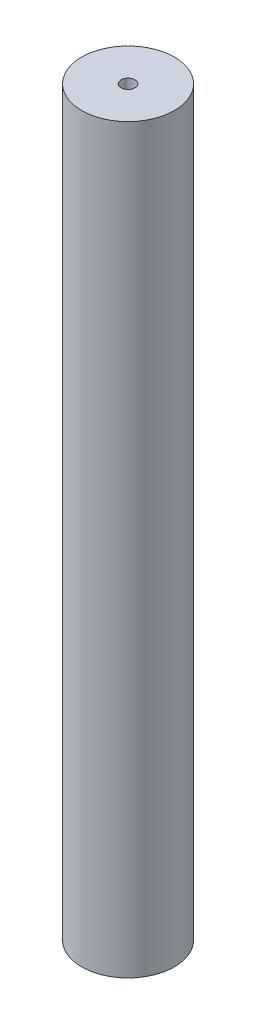
ISO-10303-21;
HEADER;
FILE_DESCRIPTION(('STEP AP214'),'2;1');
FILE_NAME('part.step','',(''),(''),'','','');
FILE_SCHEMA(('AUTOMOTIVE_DESIGN { 1 0 10303 214 1 1 1 1 }'));
ENDSEC;
DATA;
#1=APPLICATION_CONTEXT('core data for automotive mechanical design processes');
#2=APPLICATION_PROTOCOL_DEFINITION('international standard','automotive_design',2000,#1);
#3=PRODUCT_CONTEXT('',#1,'mechanical');
#4=PRODUCT('Part','Part','',(#3));
#5=PRODUCT_RELATED_PRODUCT_CATEGORY('part','',(#4));
#6=PRODUCT_DEFINITION_FORMATION('','',#4);
#7=PRODUCT_DEFINITION_CONTEXT('part definition',#1,'design');
#8=PRODUCT_DEFINITION('design','',#6,#7);
#9=PRODUCT_DEFINITION_SHAPE('','',#8);
#10=(LENGTH_UNIT() NAMED_UNIT(*) SI_UNIT(.MILLI.,.METRE.));
#11=(NAMED_UNIT(*) PLANE_ANGLE_UNIT() SI_UNIT($,.RADIAN.));
#12=(NAMED_UNIT(*) SI_UNIT($,.STERADIAN.) SOLID_ANGLE_UNIT());
#13=UNCERTAINTY_MEASURE_WITH_UNIT(LENGTH_MEASURE(1.E-05),#10,'distance_accuracy_value','');
#14=(GEOMETRIC_REPRESENTATION_CONTEXT(3) GLOBAL_UNCERTAINTY_ASSIGNED_CONTEXT((#13)) GLOBAL_UNIT_ASSIGNED_CONTEXT((#10,
#11,#12)) REPRESENTATION_CONTEXT('',''));
#15=CARTESIAN_POINT('',(0.,0.,0.));
#16=DIRECTION('',(0.,0.,1.));
#17=DIRECTION('',(1.,0.,0.));
#18=AXIS2_PLACEMENT_3D('',#15,#16,#17);
#19=CARTESIAN_POINT('',(0.,-77.0805893121358,0.));
#20=DIRECTION('',(0.,-1.,0.));
#21=DIRECTION('',(0.,0.,-1.));
#22=AXIS2_PLACEMENT_3D('',#19,#20,#21);
#23=CYLINDRICAL_SURFACE('',#22,0.75);
#24=CARTESIAN_POINT('',(0.,76.,0.));
#25=DIRECTION('',(0.,-1.,0.));
#26=DIRECTION('',(0.,0.,-1.));
#27=AXIS2_PLACEMENT_3D('',#24,#25,#26);
#28=CIRCLE('',#27,0.75);
#29=CARTESIAN_POINT('',(0.,76.,-0.75));
#30=VERTEX_POINT('',#29);
#31=EDGE_CURVE('E10',#30,#30,#28,.T.);
#32=ORIENTED_EDGE('',*,*,#31,.T.);
#33=EDGE_LOOP('',(#32));
#34=FACE_BOUND('',#33,.T.);
#35=CARTESIAN_POINT('',(0.,78.,0.));
#36=DIRECTION('',(0.,-1.,0.));
#37=DIRECTION('',(0.,0.,-1.));
#38=AXIS2_PLACEMENT_3D('',#35,#36,#37);
#39=CIRCLE('',#38,0.75);
#40=CARTESIAN_POINT('',(0.,78.,-0.75));
#41=VERTEX_POINT('',#40);
#42=EDGE_CURVE('E63',#41,#41,#39,.T.);
#43=ORIENTED_EDGE('',*,*,#42,.F.);
#44=EDGE_LOOP('',(#43));
#45=FACE_BOUND('',#44,.T.);
#46=ADVANCED_FACE('F41',(#34,#45),#23,.F.);
#47=CARTESIAN_POINT('',(0.,76.,0.));
#48=DIRECTION('',(0.,-1.,0.));
#49=DIRECTION('',(0.,0.,-1.));
#50=AXIS2_PLACEMENT_3D('',#47,#48,#49);
#51=PLANE('',#50);
#52=CARTESIAN_POINT('',(0.,76.,0.));
#53=DIRECTION('',(0.,-1.,0.));
#54=DIRECTION('',(0.,0.,-1.));
#55=AXIS2_PLACEMENT_3D('',#52,#53,#54);
#56=CIRCLE('',#55,3.);
#57=CARTESIAN_POINT('',(0.,76.,-3.));
#58=VERTEX_POINT('',#57);
#59=EDGE_CURVE('E47',#58,#58,#56,.T.);
#60=ORIENTED_EDGE('',*,*,#59,.T.);
#61=EDGE_LOOP('',(#60));
#62=FACE_BOUND('',#61,.T.);
#63=ORIENTED_EDGE('',*,*,#31,.F.);
#64=EDGE_LOOP('',(#63));
#65=FACE_BOUND('',#64,.T.);
#66=ADVANCED_FACE('F70',(#62,#65),#51,.T.);
#67=CARTESIAN_POINT('',(0.,-77.0805893121358,0.));
#68=DIRECTION('',(0.,-1.,0.));
#69=DIRECTION('',(0.,0.,-1.));
#70=AXIS2_PLACEMENT_3D('',#67,#68,#69);
#71=CYLINDRICAL_SURFACE('',#70,3.);
#72=ORIENTED_EDGE('',*,*,#59,.F.);
#73=EDGE_LOOP('',(#72));
#74=FACE_BOUND('',#73,.T.);
#75=CARTESIAN_POINT('',(0.,0.,0.));
#76=DIRECTION('',(0.,-1.,0.));
#77=DIRECTION('',(0.,0.,-1.));
#78=AXIS2_PLACEMENT_3D('',#75,#76,#77);
#79=CIRCLE('',#78,3.);
#80=CARTESIAN_POINT('',(0.,0.,-3.));
#81=VERTEX_POINT('',#80);
#82=EDGE_CURVE('E51',#81,#81,#79,.T.);
#83=ORIENTED_EDGE('',*,*,#82,.T.);
#84=EDGE_LOOP('',(#83));
#85=FACE_BOUND('',#84,.T.);
#86=ADVANCED_FACE('F74',(#74,#85),#71,.F.);
#87=CARTESIAN_POINT('',(0.,0.,0.));
#88=DIRECTION('',(0.,-1.,0.));
#89=DIRECTION('',(0.,0.,-1.));
#90=AXIS2_PLACEMENT_3D('',#87,#88,#89);
#91=PLANE('',#90);
#92=ORIENTED_EDGE('',*,*,#82,.F.);
#93=EDGE_LOOP('',(#92));
#94=FACE_BOUND('',#93,.T.);
#95=ADVANCED_FACE('F78',(#94),#91,.F.);
#96=CARTESIAN_POINT('',(0.,-2.,0.));
#97=DIRECTION('',(0.,1.,0.));
#98=DIRECTION('',(0.,0.,1.));
#99=AXIS2_PLACEMENT_3D('',#96,#97,#98);
#100=PLANE('',#99);
#101=CARTESIAN_POINT('',(0.,-2.,0.));
#102=DIRECTION('',(0.,-1.,0.));
#103=DIRECTION('',(0.,0.,-1.));
#104=AXIS2_PLACEMENT_3D('',#101,#102,#103);
#105=CIRCLE('',#104,5.00000000000001);
#106=CARTESIAN_POINT('',(0.,-2.,-5.00000000000001));
#107=VERTEX_POINT('',#106);
#108=EDGE_CURVE('E55',#107,#107,#105,.T.);
#109=ORIENTED_EDGE('',*,*,#108,.T.);
#110=EDGE_LOOP('',(#109));
#111=FACE_BOUND('',#110,.T.);
#112=ADVANCED_FACE('F85',(#111),#100,.F.);
#113=CARTESIAN_POINT('',(0.,-77.0805893121358,0.));
#114=DIRECTION('',(0.,-1.,0.));
#115=DIRECTION('',(0.,0.,-1.));
#116=AXIS2_PLACEMENT_3D('',#113,#114,#115);
#117=CYLINDRICAL_SURFACE('',#116,5.00000000000001);
#118=ORIENTED_EDGE('',*,*,#108,.F.);
#119=EDGE_LOOP('',(#118));
#120=FACE_BOUND('',#119,.T.);
#121=CARTESIAN_POINT('',(0.,78.,0.));
#122=DIRECTION('',(0.,-1.,0.));
#123=DIRECTION('',(0.,0.,-1.));
#124=AXIS2_PLACEMENT_3D('',#121,#122,#123);
#125=CIRCLE('',#124,5.);
#126=CARTESIAN_POINT('',(0.,78.,-5.));
#127=VERTEX_POINT('',#126);
#128=EDGE_CURVE('E60',#127,#127,#125,.T.);
#129=ORIENTED_EDGE('',*,*,#128,.T.);
#130=EDGE_LOOP('',(#129));
#131=FACE_BOUND('',#130,.T.);
#132=ADVANCED_FACE('F89',(#120,#131),#117,.T.);
#133=CARTESIAN_POINT('',(0.,78.,0.));
#134=DIRECTION('',(0.,-1.,0.));
#135=DIRECTION('',(0.,0.,-1.));
#136=AXIS2_PLACEMENT_3D('',#133,#134,#135);
#137=PLANE('',#136);
#138=ORIENTED_EDGE('',*,*,#128,.F.);
#139=EDGE_LOOP('',(#138));
#140=FACE_BOUND('',#139,.T.);
#141=ORIENTED_EDGE('',*,*,#42,.T.);
#142=EDGE_LOOP('',(#141));
#143=FACE_BOUND('',#142,.T.);
#144=ADVANCED_FACE('F67',(#140,#143),#137,.F.);
#145=CLOSED_SHELL('',(#46,#66,#86,#95,#112,#132,#144));
#146=MANIFOLD_SOLID_BREP('B2',#145);
#147=ADVANCED_BREP_SHAPE_REPRESENTATION('',(#18,#146),#14);
#148=SHAPE_DEFINITION_REPRESENTATION(#9,#147);
ENDSEC;
END-ISO-10303-21;
